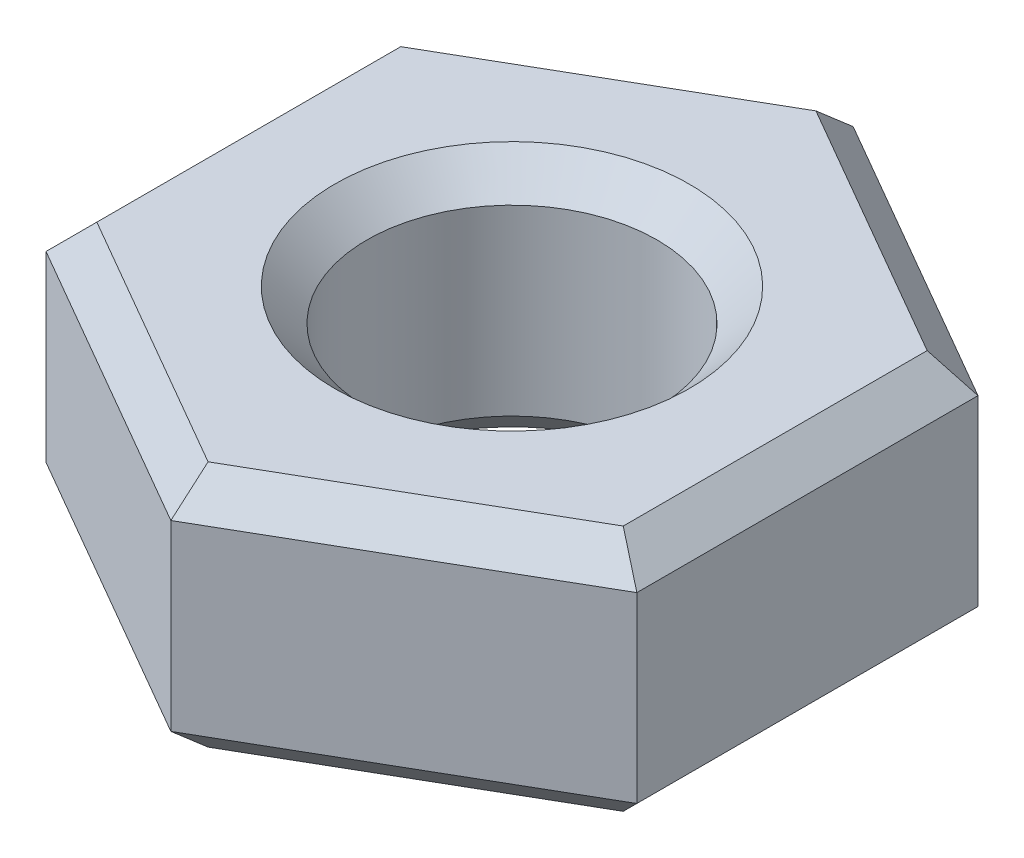
ISO-10303-21;
HEADER;
FILE_DESCRIPTION(('STEP AP214'),'2;1');
FILE_NAME('part.step','',(''),(''),'','','');
FILE_SCHEMA(('AUTOMOTIVE_DESIGN { 1 0 10303 214 1 1 1 1 }'));
ENDSEC;
DATA;
#1=APPLICATION_CONTEXT('core data for automotive mechanical design processes');
#2=APPLICATION_PROTOCOL_DEFINITION('international standard','automotive_design',2000,#1);
#3=PRODUCT_CONTEXT('',#1,'mechanical');
#4=PRODUCT('Part','Part','',(#3));
#5=PRODUCT_RELATED_PRODUCT_CATEGORY('part','',(#4));
#6=PRODUCT_DEFINITION_FORMATION('','',#4);
#7=PRODUCT_DEFINITION_CONTEXT('part definition',#1,'design');
#8=PRODUCT_DEFINITION('design','',#6,#7);
#9=PRODUCT_DEFINITION_SHAPE('','',#8);
#10=(LENGTH_UNIT() NAMED_UNIT(*) SI_UNIT(.MILLI.,.METRE.));
#11=(NAMED_UNIT(*) PLANE_ANGLE_UNIT() SI_UNIT($,.RADIAN.));
#12=(NAMED_UNIT(*) SI_UNIT($,.STERADIAN.) SOLID_ANGLE_UNIT());
#13=UNCERTAINTY_MEASURE_WITH_UNIT(LENGTH_MEASURE(1.E-05),#10,'distance_accuracy_value','');
#14=(GEOMETRIC_REPRESENTATION_CONTEXT(3) GLOBAL_UNCERTAINTY_ASSIGNED_CONTEXT((#13)) GLOBAL_UNIT_ASSIGNED_CONTEXT((#10,
#11,#12)) REPRESENTATION_CONTEXT('',''));
#15=CARTESIAN_POINT('',(0.,0.,0.));
#16=DIRECTION('',(0.,0.,1.));
#17=DIRECTION('',(1.,0.,0.));
#18=AXIS2_PLACEMENT_3D('',#15,#16,#17);
#19=CARTESIAN_POINT('',(0.,2.3,0.));
#20=DIRECTION('',(0.,1.,0.));
#21=DIRECTION('',(0.,0.,1.));
#22=AXIS2_PLACEMENT_3D('',#19,#20,#21);
#23=PLANE('',#22);
#24=CARTESIAN_POINT('',(0.,2.3,0.));
#25=DIRECTION('',(0.,1.,0.));
#26=DIRECTION('',(0.,0.,1.));
#27=AXIS2_PLACEMENT_3D('',#24,#25,#26);
#28=CIRCLE('',#27,1.65);
#29=CARTESIAN_POINT('',(0.,2.3,1.65));
#30=VERTEX_POINT('',#29);
#31=EDGE_CURVE('E11',#30,#30,#28,.F.);
#32=ORIENTED_EDGE('',*,*,#31,.T.);
#33=EDGE_LOOP('',(#32));
#34=FACE_BOUND('',#33,.T.);
#35=DIRECTION('',(0.,0.,1.));
#36=VECTOR('',#35,1.);
#37=CARTESIAN_POINT('',(-2.45000000000001,2.3,1.58771324027146));
#38=LINE('',#37,#36);
#39=CARTESIAN_POINT('',(-2.45,2.3,-1.41450815951459));
#40=VERTEX_POINT('',#39);
#41=CARTESIAN_POINT('',(-2.45000000000001,2.3,1.41450815951458));
#42=VERTEX_POINT('',#41);
#43=EDGE_CURVE('E50',#40,#42,#38,.T.);
#44=ORIENTED_EDGE('',*,*,#43,.T.);
#45=DIRECTION('',(0.866025403784437,0.,0.500000000000003));
#46=VECTOR('',#45,1.);
#47=CARTESIAN_POINT('',(0.14999999999999,2.3,2.91561885940761));
#48=LINE('',#47,#46);
#49=CARTESIAN_POINT('',(0.,2.3,2.82901631902917));
#50=VERTEX_POINT('',#49);
#51=EDGE_CURVE('E42',#42,#50,#48,.T.);
#52=ORIENTED_EDGE('',*,*,#51,.T.);
#53=DIRECTION('',(0.86602540378444,0.,-0.499999999999997));
#54=VECTOR('',#53,1.);
#55=CARTESIAN_POINT('',(2.6,2.3,1.32790561913615));
#56=LINE('',#55,#54);
#57=CARTESIAN_POINT('',(2.45,2.3,1.41450815951459));
#58=VERTEX_POINT('',#57);
#59=EDGE_CURVE('E189',#50,#58,#56,.T.);
#60=ORIENTED_EDGE('',*,*,#59,.T.);
#61=DIRECTION('',(0.,0.,-1.));
#62=VECTOR('',#61,1.);
#63=CARTESIAN_POINT('',(2.45000000000001,2.3,-1.58771324027146));
#64=LINE('',#63,#62);
#65=CARTESIAN_POINT('',(2.45000000000001,2.3,-1.41450815951458));
#66=VERTEX_POINT('',#65);
#67=EDGE_CURVE('E191',#58,#66,#64,.T.);
#68=ORIENTED_EDGE('',*,*,#67,.T.);
#69=DIRECTION('',(-0.866025403784437,0.,-0.500000000000003));
#70=VECTOR('',#69,1.);
#71=CARTESIAN_POINT('',(-0.149999999999986,2.3,-2.91561885940761));
#72=LINE('',#71,#70);
#73=CARTESIAN_POINT('',(0.,2.3,-2.82901631902917));
#74=VERTEX_POINT('',#73);
#75=EDGE_CURVE('E193',#66,#74,#72,.T.);
#76=ORIENTED_EDGE('',*,*,#75,.T.);
#77=DIRECTION('',(-0.86602540378444,0.,0.499999999999997));
#78=VECTOR('',#77,1.);
#79=CARTESIAN_POINT('',(-2.6,2.3,-1.32790561913615));
#80=LINE('',#79,#78);
#81=EDGE_CURVE('E55',#74,#40,#80,.T.);
#82=ORIENTED_EDGE('',*,*,#81,.T.);
#83=EDGE_LOOP('',(#44,#52,#60,#68,#76,#82));
#84=FACE_BOUND('',#83,.T.);
#85=ADVANCED_FACE('F33',(#34,#84),#23,.T.);
#86=CARTESIAN_POINT('',(0.,0.,0.));
#87=DIRECTION('',(0.,1.,0.));
#88=DIRECTION('',(0.,0.,1.));
#89=AXIS2_PLACEMENT_3D('',#86,#87,#88);
#90=PLANE('',#89);
#91=CARTESIAN_POINT('',(0.,0.,0.));
#92=DIRECTION('',(0.,1.,0.));
#93=DIRECTION('',(0.,0.,1.));
#94=AXIS2_PLACEMENT_3D('',#91,#92,#93);
#95=CIRCLE('',#94,1.65);
#96=CARTESIAN_POINT('',(0.,0.,-1.65));
#97=VERTEX_POINT('',#96);
#98=EDGE_CURVE('E151',#97,#97,#95,.T.);
#99=ORIENTED_EDGE('',*,*,#98,.T.);
#100=EDGE_LOOP('',(#99));
#101=FACE_BOUND('',#100,.T.);
#102=DIRECTION('',(0.866025403784437,0.,0.500000000000003));
#103=VECTOR('',#102,1.);
#104=CARTESIAN_POINT('',(1.22500000000001,0.,-2.12176223927187));
#105=LINE('',#104,#103);
#106=CARTESIAN_POINT('',(0.,0.,-2.82901631902916));
#107=VERTEX_POINT('',#106);
#108=CARTESIAN_POINT('',(2.45,0.,-1.41450815951457));
#109=VERTEX_POINT('',#108);
#110=EDGE_CURVE('E150',#107,#109,#105,.T.);
#111=ORIENTED_EDGE('',*,*,#110,.T.);
#112=DIRECTION('',(0.,0.,1.));
#113=VECTOR('',#112,1.);
#114=CARTESIAN_POINT('',(2.45,0.,0.));
#115=LINE('',#114,#113);
#116=CARTESIAN_POINT('',(2.44999999999999,0.,1.41450815951459));
#117=VERTEX_POINT('',#116);
#118=EDGE_CURVE('E129',#109,#117,#115,.T.);
#119=ORIENTED_EDGE('',*,*,#118,.T.);
#120=DIRECTION('',(-0.86602540378444,0.,0.499999999999997));
#121=VECTOR('',#120,1.);
#122=CARTESIAN_POINT('',(1.22499999999999,0.,2.12176223927188));
#123=LINE('',#122,#121);
#124=CARTESIAN_POINT('',(0.,0.,2.82901631902916));
#125=VERTEX_POINT('',#124);
#126=EDGE_CURVE('E139',#117,#125,#123,.T.);
#127=ORIENTED_EDGE('',*,*,#126,.T.);
#128=DIRECTION('',(-0.866025403784437,0.,-0.500000000000003));
#129=VECTOR('',#128,1.);
#130=CARTESIAN_POINT('',(-1.22500000000001,0.,2.12176223927187));
#131=LINE('',#130,#129);
#132=CARTESIAN_POINT('',(-2.45,0.,1.41450815951457));
#133=VERTEX_POINT('',#132);
#134=EDGE_CURVE('E145',#125,#133,#131,.T.);
#135=ORIENTED_EDGE('',*,*,#134,.T.);
#136=DIRECTION('',(0.,0.,-1.));
#137=VECTOR('',#136,1.);
#138=CARTESIAN_POINT('',(-2.45,0.,0.));
#139=LINE('',#138,#137);
#140=CARTESIAN_POINT('',(-2.44999999999999,0.,-1.41450815951459));
#141=VERTEX_POINT('',#140);
#142=EDGE_CURVE('E251',#133,#141,#139,.T.);
#143=ORIENTED_EDGE('',*,*,#142,.T.);
#144=DIRECTION('',(0.86602540378444,0.,-0.499999999999997));
#145=VECTOR('',#144,1.);
#146=CARTESIAN_POINT('',(-1.22499999999999,0.,-2.12176223927188));
#147=LINE('',#146,#145);
#148=EDGE_CURVE('E156',#141,#107,#147,.T.);
#149=ORIENTED_EDGE('',*,*,#148,.T.);
#150=EDGE_LOOP('',(#111,#119,#127,#135,#143,#149));
#151=FACE_BOUND('',#150,.T.);
#152=ADVANCED_FACE('F148',(#101,#151),#90,.F.);
#153=CARTESIAN_POINT('',(0.,2.3,3.17542648054294));
#154=DIRECTION('',(-0.499999999999997,0.,-0.86602540378444));
#155=DIRECTION('',(-0.86602540378444,0.,0.499999999999997));
#156=AXIS2_PLACEMENT_3D('',#153,#154,#155);
#157=PLANE('',#156);
#158=DIRECTION('',(0.,-1.,0.));
#159=VECTOR('',#158,1.);
#160=CARTESIAN_POINT('',(0.,2.3,3.17542648054294));
#161=LINE('',#160,#159);
#162=CARTESIAN_POINT('',(0.,2.,3.17542648054294));
#163=VERTEX_POINT('',#162);
#164=CARTESIAN_POINT('',(0.,0.3,3.17542648054294));
#165=VERTEX_POINT('',#164);
#166=EDGE_CURVE('E208',#163,#165,#161,.T.);
#167=ORIENTED_EDGE('',*,*,#166,.T.);
#168=DIRECTION('',(0.86602540378444,0.,-0.499999999999997));
#169=VECTOR('',#168,1.);
#170=CARTESIAN_POINT('',(0.,0.3,3.17542648054294));
#171=LINE('',#170,#169);
#172=CARTESIAN_POINT('',(2.75,0.3,1.58771324027148));
#173=VERTEX_POINT('',#172);
#174=EDGE_CURVE('E187',#165,#173,#171,.T.);
#175=ORIENTED_EDGE('',*,*,#174,.T.);
#176=DIRECTION('',(0.,-1.,0.));
#177=VECTOR('',#176,1.);
#178=CARTESIAN_POINT('',(2.75,2.3,1.58771324027148));
#179=LINE('',#178,#177);
#180=CARTESIAN_POINT('',(2.75,2.,1.58771324027148));
#181=VERTEX_POINT('',#180);
#182=EDGE_CURVE('E146',#181,#173,#179,.T.);
#183=ORIENTED_EDGE('',*,*,#182,.F.);
#184=DIRECTION('',(-0.86602540378444,0.,0.499999999999997));
#185=VECTOR('',#184,1.);
#186=CARTESIAN_POINT('',(0.,2.,3.17542648054294));
#187=LINE('',#186,#185);
#188=EDGE_CURVE('E185',#181,#163,#187,.T.);
#189=ORIENTED_EDGE('',*,*,#188,.T.);
#190=EDGE_LOOP('',(#167,#175,#183,#189));
#191=FACE_BOUND('',#190,.T.);
#192=ADVANCED_FACE('F275',(#191),#157,.F.);
#193=CARTESIAN_POINT('',(2.75,2.3,1.58771324027148));
#194=DIRECTION('',(-1.,0.,0.));
#195=DIRECTION('',(0.,0.,1.));
#196=AXIS2_PLACEMENT_3D('',#193,#194,#195);
#197=PLANE('',#196);
#198=ORIENTED_EDGE('',*,*,#182,.T.);
#199=DIRECTION('',(0.,0.,-1.));
#200=VECTOR('',#199,1.);
#201=CARTESIAN_POINT('',(2.75,0.300000000000001,1.58771324027148));
#202=LINE('',#201,#200);
#203=CARTESIAN_POINT('',(2.75,0.300000000000001,-1.58771324027146));
#204=VERTEX_POINT('',#203);
#205=EDGE_CURVE('E132',#173,#204,#202,.T.);
#206=ORIENTED_EDGE('',*,*,#205,.T.);
#207=DIRECTION('',(0.,-1.,0.));
#208=VECTOR('',#207,1.);
#209=CARTESIAN_POINT('',(2.75,2.3,-1.58771324027146));
#210=LINE('',#209,#208);
#211=CARTESIAN_POINT('',(2.75,2.,-1.58771324027146));
#212=VERTEX_POINT('',#211);
#213=EDGE_CURVE('E237',#212,#204,#210,.T.);
#214=ORIENTED_EDGE('',*,*,#213,.F.);
#215=DIRECTION('',(0.,0.,1.));
#216=VECTOR('',#215,1.);
#217=CARTESIAN_POINT('',(2.75,2.,1.58771324027148));
#218=LINE('',#217,#216);
#219=EDGE_CURVE('E165',#212,#181,#218,.T.);
#220=ORIENTED_EDGE('',*,*,#219,.T.);
#221=EDGE_LOOP('',(#198,#206,#214,#220));
#222=FACE_BOUND('',#221,.T.);
#223=ADVANCED_FACE('F242',(#222),#197,.F.);
#224=CARTESIAN_POINT('',(2.75,2.3,-1.58771324027146));
#225=DIRECTION('',(-0.500000000000003,0.,0.866025403784437));
#226=DIRECTION('',(0.866025403784437,0.,0.500000000000003));
#227=AXIS2_PLACEMENT_3D('',#224,#225,#226);
#228=PLANE('',#227);
#229=ORIENTED_EDGE('',*,*,#213,.T.);
#230=DIRECTION('',(-0.866025403784437,0.,-0.500000000000003));
#231=VECTOR('',#230,1.);
#232=CARTESIAN_POINT('',(2.75,0.300000000000001,-1.58771324027146));
#233=LINE('',#232,#231);
#234=CARTESIAN_POINT('',(0.,0.300000000000001,-3.17542648054294));
#235=VERTEX_POINT('',#234);
#236=EDGE_CURVE('E170',#204,#235,#233,.T.);
#237=ORIENTED_EDGE('',*,*,#236,.T.);
#238=DIRECTION('',(0.,-1.,0.));
#239=VECTOR('',#238,1.);
#240=CARTESIAN_POINT('',(0.,2.3,-3.17542648054294));
#241=LINE('',#240,#239);
#242=CARTESIAN_POINT('',(0.,2.,-3.17542648054294));
#243=VERTEX_POINT('',#242);
#244=EDGE_CURVE('E239',#243,#235,#241,.T.);
#245=ORIENTED_EDGE('',*,*,#244,.F.);
#246=DIRECTION('',(0.866025403784437,0.,0.500000000000003));
#247=VECTOR('',#246,1.);
#248=CARTESIAN_POINT('',(2.75,2.,-1.58771324027146));
#249=LINE('',#248,#247);
#250=EDGE_CURVE('E168',#243,#212,#249,.T.);
#251=ORIENTED_EDGE('',*,*,#250,.T.);
#252=EDGE_LOOP('',(#229,#237,#245,#251));
#253=FACE_BOUND('',#252,.T.);
#254=ADVANCED_FACE('F236',(#253),#228,.F.);
#255=CARTESIAN_POINT('',(0.,2.3,-3.17542648054294));
#256=DIRECTION('',(0.499999999999997,0.,0.86602540378444));
#257=DIRECTION('',(0.86602540378444,0.,-0.499999999999997));
#258=AXIS2_PLACEMENT_3D('',#255,#256,#257);
#259=PLANE('',#258);
#260=ORIENTED_EDGE('',*,*,#244,.T.);
#261=DIRECTION('',(-0.86602540378444,0.,0.499999999999997));
#262=VECTOR('',#261,1.);
#263=CARTESIAN_POINT('',(0.,0.300000000000001,-3.17542648054294));
#264=LINE('',#263,#262);
#265=CARTESIAN_POINT('',(-2.74999999999999,0.300000000000001,-1.58771324027148));
#266=VERTEX_POINT('',#265);
#267=EDGE_CURVE('E174',#235,#266,#264,.T.);
#268=ORIENTED_EDGE('',*,*,#267,.T.);
#269=DIRECTION('',(0.,-1.,0.));
#270=VECTOR('',#269,1.);
#271=CARTESIAN_POINT('',(-2.74999999999999,2.3,-1.58771324027148));
#272=LINE('',#271,#270);
#273=CARTESIAN_POINT('',(-2.74999999999999,2.,-1.58771324027148));
#274=VERTEX_POINT('',#273);
#275=EDGE_CURVE('E246',#274,#266,#272,.T.);
#276=ORIENTED_EDGE('',*,*,#275,.F.);
#277=DIRECTION('',(0.86602540378444,0.,-0.499999999999997));
#278=VECTOR('',#277,1.);
#279=CARTESIAN_POINT('',(0.,2.,-3.17542648054294));
#280=LINE('',#279,#278);
#281=EDGE_CURVE('E172',#274,#243,#280,.T.);
#282=ORIENTED_EDGE('',*,*,#281,.T.);
#283=EDGE_LOOP('',(#260,#268,#276,#282));
#284=FACE_BOUND('',#283,.T.);
#285=ADVANCED_FACE('F263',(#284),#259,.F.);
#286=CARTESIAN_POINT('',(-2.74999999999999,2.3,-1.58771324027148));
#287=DIRECTION('',(1.,0.,0.));
#288=DIRECTION('',(0.,0.,-1.));
#289=AXIS2_PLACEMENT_3D('',#286,#287,#288);
#290=PLANE('',#289);
#291=ORIENTED_EDGE('',*,*,#275,.T.);
#292=DIRECTION('',(0.,0.,1.));
#293=VECTOR('',#292,1.);
#294=CARTESIAN_POINT('',(-2.74999999999999,0.300000000000001,-1.58771324027148));
#295=LINE('',#294,#293);
#296=CARTESIAN_POINT('',(-2.75,0.300000000000001,1.58771324027146));
#297=VERTEX_POINT('',#296);
#298=EDGE_CURVE('E178',#266,#297,#295,.T.);
#299=ORIENTED_EDGE('',*,*,#298,.T.);
#300=DIRECTION('',(0.,-1.,0.));
#301=VECTOR('',#300,1.);
#302=CARTESIAN_POINT('',(-2.75,2.3,1.58771324027146));
#303=LINE('',#302,#301);
#304=CARTESIAN_POINT('',(-2.75,2.,1.58771324027146));
#305=VERTEX_POINT('',#304);
#306=EDGE_CURVE('E268',#305,#297,#303,.T.);
#307=ORIENTED_EDGE('',*,*,#306,.F.);
#308=DIRECTION('',(0.,0.,-1.));
#309=VECTOR('',#308,1.);
#310=CARTESIAN_POINT('',(-2.74999999999999,2.,-1.58771324027148));
#311=LINE('',#310,#309);
#312=EDGE_CURVE('E176',#305,#274,#311,.T.);
#313=ORIENTED_EDGE('',*,*,#312,.T.);
#314=EDGE_LOOP('',(#291,#299,#307,#313));
#315=FACE_BOUND('',#314,.T.);
#316=ADVANCED_FACE('F286',(#315),#290,.F.);
#317=CARTESIAN_POINT('',(-2.75,2.3,1.58771324027146));
#318=DIRECTION('',(0.500000000000003,0.,-0.866025403784437));
#319=DIRECTION('',(-0.866025403784437,0.,-0.500000000000003));
#320=AXIS2_PLACEMENT_3D('',#317,#318,#319);
#321=PLANE('',#320);
#322=ORIENTED_EDGE('',*,*,#306,.T.);
#323=DIRECTION('',(0.866025403784437,0.,0.500000000000003));
#324=VECTOR('',#323,1.);
#325=CARTESIAN_POINT('',(-2.75,0.300000000000001,1.58771324027146));
#326=LINE('',#325,#324);
#327=EDGE_CURVE('E183',#297,#165,#326,.T.);
#328=ORIENTED_EDGE('',*,*,#327,.T.);
#329=ORIENTED_EDGE('',*,*,#166,.F.);
#330=DIRECTION('',(-0.866025403784437,0.,-0.500000000000003));
#331=VECTOR('',#330,1.);
#332=CARTESIAN_POINT('',(-2.75,2.,1.58771324027146));
#333=LINE('',#332,#331);
#334=EDGE_CURVE('E180',#163,#305,#333,.T.);
#335=ORIENTED_EDGE('',*,*,#334,.T.);
#336=EDGE_LOOP('',(#322,#328,#329,#335));
#337=FACE_BOUND('',#336,.T.);
#338=ADVANCED_FACE('F287',(#337),#321,.F.);
#339=CARTESIAN_POINT('',(0.,2.3,0.));
#340=DIRECTION('',(0.,-1.,0.));
#341=DIRECTION('',(0.,0.,-1.));
#342=AXIS2_PLACEMENT_3D('',#339,#340,#341);
#343=CYLINDRICAL_SURFACE('',#342,1.35);
#344=CARTESIAN_POINT('',(0.,0.300000000000001,0.));
#345=DIRECTION('',(0.,1.,0.));
#346=DIRECTION('',(0.,0.,1.));
#347=AXIS2_PLACEMENT_3D('',#344,#345,#346);
#348=CIRCLE('',#347,1.35);
#349=CARTESIAN_POINT('',(0.,0.300000000000001,-1.35));
#350=VERTEX_POINT('',#349);
#351=EDGE_CURVE('E162',#350,#350,#348,.F.);
#352=ORIENTED_EDGE('',*,*,#351,.T.);
#353=EDGE_LOOP('',(#352));
#354=FACE_BOUND('',#353,.T.);
#355=CARTESIAN_POINT('',(0.,2.,0.));
#356=DIRECTION('',(0.,1.,0.));
#357=DIRECTION('',(0.,0.,1.));
#358=AXIS2_PLACEMENT_3D('',#355,#356,#357);
#359=CIRCLE('',#358,1.35);
#360=CARTESIAN_POINT('',(0.,2.,1.35));
#361=VERTEX_POINT('',#360);
#362=EDGE_CURVE('E154',#361,#361,#359,.T.);
#363=ORIENTED_EDGE('',*,*,#362,.T.);
#364=EDGE_LOOP('',(#363));
#365=FACE_BOUND('',#364,.T.);
#366=ADVANCED_FACE('F306',(#354,#365),#343,.F.);
#367=CARTESIAN_POINT('',(0.,0.,0.));
#368=DIRECTION('',(0.,-1.,0.));
#369=DIRECTION('',(0.,0.,-1.));
#370=AXIS2_PLACEMENT_3D('',#367,#368,#369);
#371=CONICAL_SURFACE('',#370,1.65,0.785398163397446);
#372=CARTESIAN_POINT('',(0.,0.300000000000001,-1.35));
#373=CARTESIAN_POINT('',(0.,0.296875000000001,-1.353125));
#374=CARTESIAN_POINT('',(0.,0.293750000000001,-1.35625));
#375=CARTESIAN_POINT('',(0.,0.287500000000001,-1.3625));
#376=CARTESIAN_POINT('',(0.,0.284375000000001,-1.365625));
#377=CARTESIAN_POINT('',(0.,0.278125000000001,-1.371875));
#378=CARTESIAN_POINT('',(0.,0.275000000000001,-1.375));
#379=CARTESIAN_POINT('',(0.,0.268750000000001,-1.38125));
#380=CARTESIAN_POINT('',(0.,0.265625000000001,-1.384375));
#381=CARTESIAN_POINT('',(0.,0.259375000000001,-1.390625));
#382=CARTESIAN_POINT('',(0.,0.256250000000001,-1.39375));
#383=CARTESIAN_POINT('',(0.,0.250000000000001,-1.4));
#384=CARTESIAN_POINT('',(0.,0.246875000000001,-1.403125));
#385=CARTESIAN_POINT('',(0.,0.240625000000001,-1.409375));
#386=CARTESIAN_POINT('',(0.,0.237500000000001,-1.4125));
#387=CARTESIAN_POINT('',(0.,0.231250000000001,-1.41875));
#388=CARTESIAN_POINT('',(0.,0.228125000000001,-1.421875));
#389=CARTESIAN_POINT('',(0.,0.221875000000001,-1.428125));
#390=CARTESIAN_POINT('',(0.,0.218750000000001,-1.43125));
#391=CARTESIAN_POINT('',(0.,0.212500000000001,-1.4375));
#392=CARTESIAN_POINT('',(0.,0.209375000000001,-1.440625));
#393=CARTESIAN_POINT('',(0.,0.203125,-1.446875));
#394=CARTESIAN_POINT('',(0.,0.200000000000001,-1.45));
#395=CARTESIAN_POINT('',(0.,0.193750000000001,-1.45625));
#396=CARTESIAN_POINT('',(0.,0.190625,-1.459375));
#397=CARTESIAN_POINT('',(0.,0.184375,-1.465625));
#398=CARTESIAN_POINT('',(0.,0.18125,-1.46875));
#399=CARTESIAN_POINT('',(0.,0.175,-1.475));
#400=CARTESIAN_POINT('',(0.,0.171875,-1.478125));
#401=CARTESIAN_POINT('',(0.,0.165625,-1.484375));
#402=CARTESIAN_POINT('',(0.,0.1625,-1.4875));
#403=CARTESIAN_POINT('',(0.,0.15625,-1.49375));
#404=CARTESIAN_POINT('',(0.,0.153125,-1.496875));
#405=CARTESIAN_POINT('',(0.,0.146875,-1.503125));
#406=CARTESIAN_POINT('',(0.,0.14375,-1.50625));
#407=CARTESIAN_POINT('',(0.,0.1375,-1.5125));
#408=CARTESIAN_POINT('',(0.,0.134375,-1.515625));
#409=CARTESIAN_POINT('',(0.,0.128125,-1.521875));
#410=CARTESIAN_POINT('',(0.,0.125,-1.525));
#411=CARTESIAN_POINT('',(0.,0.11875,-1.53125));
#412=CARTESIAN_POINT('',(0.,0.115625,-1.534375));
#413=CARTESIAN_POINT('',(0.,0.109375,-1.540625));
#414=CARTESIAN_POINT('',(0.,0.10625,-1.54375));
#415=CARTESIAN_POINT('',(0.,0.1,-1.55));
#416=CARTESIAN_POINT('',(0.,0.0968750000000002,-1.553125));
#417=CARTESIAN_POINT('',(0.,0.0906250000000002,-1.559375));
#418=CARTESIAN_POINT('',(0.,0.0875000000000002,-1.5625));
#419=CARTESIAN_POINT('',(0.,0.0812500000000002,-1.56875));
#420=CARTESIAN_POINT('',(0.,0.0781250000000002,-1.571875));
#421=CARTESIAN_POINT('',(0.,0.0718750000000001,-1.578125));
#422=CARTESIAN_POINT('',(0.,0.0687500000000002,-1.58125));
#423=CARTESIAN_POINT('',(0.,0.0625000000000002,-1.5875));
#424=CARTESIAN_POINT('',(0.,0.0593750000000002,-1.590625));
#425=CARTESIAN_POINT('',(0.,0.0531250000000002,-1.596875));
#426=CARTESIAN_POINT('',(0.,0.0500000000000001,-1.6));
#427=CARTESIAN_POINT('',(0.,0.0437500000000001,-1.60625));
#428=CARTESIAN_POINT('',(0.,0.0406250000000001,-1.609375));
#429=CARTESIAN_POINT('',(0.,0.0343750000000001,-1.615625));
#430=CARTESIAN_POINT('',(0.,0.03125,-1.61875));
#431=CARTESIAN_POINT('',(0.,0.025,-1.625));
#432=CARTESIAN_POINT('',(0.,0.0218750000000001,-1.628125));
#433=CARTESIAN_POINT('',(0.,0.0156250000000001,-1.634375));
#434=CARTESIAN_POINT('',(0.,0.0125000000000001,-1.6375));
#435=CARTESIAN_POINT('',(0.,0.00625,-1.64375));
#436=CARTESIAN_POINT('',(0.,0.00312499999999997,-1.646875));
#437=CARTESIAN_POINT('',(0.,0.,-1.65));
#438=B_SPLINE_CURVE_WITH_KNOTS('',3,(#372,#373,#374,#375,#376,#377,#378,#379,#380,#381,#382,
#383,#384,#385,#386,#387,#388,#389,#390,#391,#392,#393,#394,#395,#396,#397,#398,#399,#400,#401,
#402,#403,#404,#405,#406,#407,#408,#409,#410,#411,#412,#413,#414,#415,#416,#417,#418,#419,#420,
#421,#422,#423,#424,#425,#426,#427,#428,#429,#430,#431,#432,#433,#434,#435,#436,#437),
.UNSPECIFIED.,.F.,.F.,(4,2,2,2,2,2,2,2,2,2,2,2,2,2,2,2,2,2,2,2,2,2,2,2,2,2,2,2,2,2,2,2,4),(0.,
0.0132582521472478,0.0265165042944955,0.0397747564417433,0.053033008588991,0.066291260736239,
0.0795495128834866,0.0928077650307344,0.106066017177982,0.11932426932523,0.132582521472478,
0.145840773619726,0.159099025766973,0.172357277914221,0.185615530061469,0.198873782208717,
0.212132034355964,0.225390286503212,0.23864853865046,0.251906790797708,0.265165042944955,
0.278423295092203,0.291681547239451,0.304939799386699,0.318198051533946,0.331456303681194,
0.344714555828442,0.35797280797569,0.371231060122938,0.384489312270186,0.397747564417433,
0.411005816564681,0.424264068711929),.UNSPECIFIED.);
#439=EDGE_CURVE('BSEAM320',#350,#97,#438,.T.);
#440=ORIENTED_EDGE('',*,*,#351,.F.);
#441=ORIENTED_EDGE('',*,*,#98,.F.);
#442=ORIENTED_EDGE('',*,*,#439,.T.);
#443=ORIENTED_EDGE('',*,*,#439,.F.);
#444=EDGE_LOOP('',(#440,#442,#441,#443));
#445=FACE_BOUND('',#444,.T.);
#446=ADVANCED_FACE('F320',(#445),#371,.F.);
#447=CARTESIAN_POINT('',(-2.74999999999999,0.300000000000001,-1.58771324027148));
#448=DIRECTION('',(0.707106781186546,0.707106781186549,0.));
#449=DIRECTION('',(0.,0.,1.));
#450=AXIS2_PLACEMENT_3D('',#447,#448,#449);
#451=PLANE('',#450);
#452=DIRECTION('',(0.654653670707977,-0.654653670707976,0.37796447300923));
#453=VECTOR('',#452,1.);
#454=CARTESIAN_POINT('',(-2.74999999999999,0.300000000000001,-1.58771324027148));
#455=LINE('',#454,#453);
#456=EDGE_CURVE('E202',#141,#266,#455,.F.);
#457=ORIENTED_EDGE('',*,*,#456,.F.);
#458=ORIENTED_EDGE('',*,*,#142,.F.);
#459=DIRECTION('',(0.65465367070798,-0.654653670707975,-0.377964473009226));
#460=VECTOR('',#459,1.);
#461=CARTESIAN_POINT('',(-2.75,0.300000000000001,1.58771324027146));
#462=LINE('',#461,#460);
#463=EDGE_CURVE('E205',#297,#133,#462,.T.);
#464=ORIENTED_EDGE('',*,*,#463,.F.);
#465=ORIENTED_EDGE('',*,*,#298,.F.);
#466=EDGE_LOOP('',(#457,#458,#464,#465));
#467=FACE_BOUND('',#466,.T.);
#468=ADVANCED_FACE('F284',(#467),#451,.F.);
#469=CARTESIAN_POINT('',(-2.75,0.300000000000001,1.58771324027146));
#470=DIRECTION('',(0.353553390593275,0.707106781186549,-0.612372435695792));
#471=DIRECTION('',(0.866025403784437,0.,0.500000000000003));
#472=AXIS2_PLACEMENT_3D('',#469,#470,#471);
#473=PLANE('',#472);
#474=ORIENTED_EDGE('',*,*,#463,.T.);
#475=ORIENTED_EDGE('',*,*,#134,.F.);
#476=DIRECTION('',(0.,-0.654653670707975,-0.755928946018456));
#477=VECTOR('',#476,1.);
#478=CARTESIAN_POINT('',(0.,0.300000000000001,3.17542648054294));
#479=LINE('',#478,#477);
#480=EDGE_CURVE('E142',#165,#125,#479,.T.);
#481=ORIENTED_EDGE('',*,*,#480,.F.);
#482=ORIENTED_EDGE('',*,*,#327,.F.);
#483=EDGE_LOOP('',(#474,#475,#481,#482));
#484=FACE_BOUND('',#483,.T.);
#485=ADVANCED_FACE('F281',(#484),#473,.F.);
#486=CARTESIAN_POINT('',(0.,0.300000000000001,-3.17542648054294));
#487=DIRECTION('',(0.353553390593271,0.707106781186549,0.612372435695795));
#488=DIRECTION('',(-0.86602540378444,0.,0.499999999999997));
#489=AXIS2_PLACEMENT_3D('',#486,#487,#488);
#490=PLANE('',#489);
#491=ORIENTED_EDGE('',*,*,#456,.T.);
#492=ORIENTED_EDGE('',*,*,#267,.F.);
#493=DIRECTION('',(0.,-0.654653670707976,0.755928946018456));
#494=VECTOR('',#493,1.);
#495=CARTESIAN_POINT('',(0.,0.300000000000001,-3.17542648054294));
#496=LINE('',#495,#494);
#497=EDGE_CURVE('E135',#107,#235,#496,.F.);
#498=ORIENTED_EDGE('',*,*,#497,.F.);
#499=ORIENTED_EDGE('',*,*,#148,.F.);
#500=EDGE_LOOP('',(#491,#492,#498,#499));
#501=FACE_BOUND('',#500,.T.);
#502=ADVANCED_FACE('F258',(#501),#490,.F.);
#503=CARTESIAN_POINT('',(0.,0.300000000000001,3.17542648054294));
#504=DIRECTION('',(-0.353553390593271,0.707106781186549,-0.612372435695794));
#505=DIRECTION('',(0.86602540378444,0.,-0.499999999999997));
#506=AXIS2_PLACEMENT_3D('',#503,#504,#505);
#507=PLANE('',#506);
#508=ORIENTED_EDGE('',*,*,#480,.T.);
#509=ORIENTED_EDGE('',*,*,#126,.F.);
#510=DIRECTION('',(0.654653670707977,0.654653670707975,0.377964473009231));
#511=VECTOR('',#510,1.);
#512=CARTESIAN_POINT('',(1.96428571428571,-0.485714285714284,1.1340808859082));
#513=LINE('',#512,#511);
#514=EDGE_CURVE('E125',#173,#117,#513,.F.);
#515=ORIENTED_EDGE('',*,*,#514,.F.);
#516=ORIENTED_EDGE('',*,*,#174,.F.);
#517=EDGE_LOOP('',(#508,#509,#515,#516));
#518=FACE_BOUND('',#517,.T.);
#519=ADVANCED_FACE('F140',(#518),#507,.F.);
#520=CARTESIAN_POINT('',(2.75,0.300000000000001,-1.58771324027146));
#521=DIRECTION('',(-0.353553390593275,0.707106781186549,0.612372435695792));
#522=DIRECTION('',(-0.866025403784437,0.,-0.500000000000003));
#523=AXIS2_PLACEMENT_3D('',#520,#521,#522);
#524=PLANE('',#523);
#525=ORIENTED_EDGE('',*,*,#497,.T.);
#526=ORIENTED_EDGE('',*,*,#236,.F.);
#527=DIRECTION('',(-0.65465367070798,-0.654653670707976,0.377964473009226));
#528=VECTOR('',#527,1.);
#529=CARTESIAN_POINT('',(2.75,0.300000000000001,-1.58771324027146));
#530=LINE('',#529,#528);
#531=EDGE_CURVE('E136',#109,#204,#530,.F.);
#532=ORIENTED_EDGE('',*,*,#531,.F.);
#533=ORIENTED_EDGE('',*,*,#110,.F.);
#534=EDGE_LOOP('',(#525,#526,#532,#533));
#535=FACE_BOUND('',#534,.T.);
#536=ADVANCED_FACE('F261',(#535),#524,.F.);
#537=CARTESIAN_POINT('',(2.75,0.300000000000001,1.58771324027148));
#538=DIRECTION('',(-0.707106781186546,0.707106781186549,0.));
#539=DIRECTION('',(0.,0.,-1.));
#540=AXIS2_PLACEMENT_3D('',#537,#538,#539);
#541=PLANE('',#540);
#542=ORIENTED_EDGE('',*,*,#514,.T.);
#543=ORIENTED_EDGE('',*,*,#118,.F.);
#544=ORIENTED_EDGE('',*,*,#531,.T.);
#545=ORIENTED_EDGE('',*,*,#205,.F.);
#546=EDGE_LOOP('',(#542,#543,#544,#545));
#547=FACE_BOUND('',#546,.T.);
#548=ADVANCED_FACE('F127',(#547),#541,.F.);
#549=CARTESIAN_POINT('',(0.,2.,0.));
#550=DIRECTION('',(0.,1.,0.));
#551=DIRECTION('',(0.,0.,1.));
#552=AXIS2_PLACEMENT_3D('',#549,#550,#551);
#553=CONICAL_SURFACE('',#552,1.35,0.78539816339745);
#554=ORIENTED_EDGE('',*,*,#31,.F.);
#555=EDGE_LOOP('',(#554));
#556=FACE_BOUND('',#555,.T.);
#557=ORIENTED_EDGE('',*,*,#362,.F.);
#558=EDGE_LOOP('',(#557));
#559=FACE_BOUND('',#558,.T.);
#560=ADVANCED_FACE('F326',(#556,#559),#553,.F.);
#561=CARTESIAN_POINT('',(1.22500000000001,2.3,-2.12176223927187));
#562=DIRECTION('',(0.353553390593277,0.707106781186546,-0.612372435695794));
#563=DIRECTION('',(0.866025403784437,0.,0.500000000000003));
#564=AXIS2_PLACEMENT_3D('',#561,#562,#563);
#565=PLANE('',#564);
#566=DIRECTION('',(-0.654653670707978,0.654653670707979,0.377964473009224));
#567=VECTOR('',#566,1.);
#568=CARTESIAN_POINT('',(2.10000000000001,2.65,-1.21243556529821));
#569=LINE('',#568,#567);
#570=EDGE_CURVE('E218',#212,#66,#569,.T.);
#571=ORIENTED_EDGE('',*,*,#570,.F.);
#572=ORIENTED_EDGE('',*,*,#250,.F.);
#573=DIRECTION('',(0.,0.654653670707979,0.755928946018453));
#574=VECTOR('',#573,1.);
#575=CARTESIAN_POINT('',(0.,2.65,-2.42487113059643));
#576=LINE('',#575,#574);
#577=EDGE_CURVE('E37',#74,#243,#576,.F.);
#578=ORIENTED_EDGE('',*,*,#577,.F.);
#579=ORIENTED_EDGE('',*,*,#75,.F.);
#580=EDGE_LOOP('',(#571,#572,#578,#579));
#581=FACE_BOUND('',#580,.T.);
#582=ADVANCED_FACE('F35',(#581),#565,.T.);
#583=CARTESIAN_POINT('',(-1.22499999999999,2.3,-2.12176223927188));
#584=DIRECTION('',(-0.353553390593272,0.707106781186546,-0.612372435695797));
#585=DIRECTION('',(0.86602540378444,0.,-0.499999999999997));
#586=AXIS2_PLACEMENT_3D('',#583,#584,#585);
#587=PLANE('',#586);
#588=ORIENTED_EDGE('',*,*,#577,.T.);
#589=ORIENTED_EDGE('',*,*,#281,.F.);
#590=DIRECTION('',(0.654653670707975,0.654653670707979,0.377964473009228));
#591=VECTOR('',#590,1.);
#592=CARTESIAN_POINT('',(-2.1,2.65,-1.21243556529822));
#593=LINE('',#592,#591);
#594=EDGE_CURVE('E216',#40,#274,#593,.F.);
#595=ORIENTED_EDGE('',*,*,#594,.F.);
#596=ORIENTED_EDGE('',*,*,#81,.F.);
#597=EDGE_LOOP('',(#588,#589,#595,#596));
#598=FACE_BOUND('',#597,.T.);
#599=ADVANCED_FACE('F228',(#598),#587,.T.);
#600=CARTESIAN_POINT('',(2.45,2.3,0.));
#601=DIRECTION('',(0.707106781186548,0.707106781186546,0.));
#602=DIRECTION('',(0.,0.,1.));
#603=AXIS2_PLACEMENT_3D('',#600,#601,#602);
#604=PLANE('',#603);
#605=ORIENTED_EDGE('',*,*,#570,.T.);
#606=ORIENTED_EDGE('',*,*,#67,.F.);
#607=DIRECTION('',(-0.654653670707975,0.654653670707978,-0.377964473009229));
#608=VECTOR('',#607,1.);
#609=CARTESIAN_POINT('',(2.1,2.65,1.21243556529822));
#610=LINE('',#609,#608);
#611=EDGE_CURVE('E213',#181,#58,#610,.T.);
#612=ORIENTED_EDGE('',*,*,#611,.F.);
#613=ORIENTED_EDGE('',*,*,#219,.F.);
#614=EDGE_LOOP('',(#605,#606,#612,#613));
#615=FACE_BOUND('',#614,.T.);
#616=ADVANCED_FACE('F347',(#615),#604,.T.);
#617=CARTESIAN_POINT('',(-2.45,2.3,0.));
#618=DIRECTION('',(-0.707106781186548,0.707106781186546,0.));
#619=DIRECTION('',(0.,0.,-1.));
#620=AXIS2_PLACEMENT_3D('',#617,#618,#619);
#621=PLANE('',#620);
#622=ORIENTED_EDGE('',*,*,#594,.T.);
#623=ORIENTED_EDGE('',*,*,#312,.F.);
#624=DIRECTION('',(0.654653670707978,0.654653670707979,-0.377964473009223));
#625=VECTOR('',#624,1.);
#626=CARTESIAN_POINT('',(-2.10000000000001,2.65,1.21243556529821));
#627=LINE('',#626,#625);
#628=EDGE_CURVE('E211',#42,#305,#627,.F.);
#629=ORIENTED_EDGE('',*,*,#628,.F.);
#630=ORIENTED_EDGE('',*,*,#43,.F.);
#631=EDGE_LOOP('',(#622,#623,#629,#630));
#632=FACE_BOUND('',#631,.T.);
#633=ADVANCED_FACE('F344',(#632),#621,.T.);
#634=CARTESIAN_POINT('',(1.22499999999999,2.3,2.12176223927188));
#635=DIRECTION('',(0.353553390593272,0.707106781186547,0.612372435695797));
#636=DIRECTION('',(-0.86602540378444,0.,0.499999999999997));
#637=AXIS2_PLACEMENT_3D('',#634,#635,#636);
#638=PLANE('',#637);
#639=ORIENTED_EDGE('',*,*,#611,.T.);
#640=ORIENTED_EDGE('',*,*,#59,.F.);
#641=DIRECTION('',(0.,-0.654653670707979,0.755928946018453));
#642=VECTOR('',#641,1.);
#643=CARTESIAN_POINT('',(0.,2.65,2.42487113059643));
#644=LINE('',#643,#642);
#645=EDGE_CURVE('E209',#163,#50,#644,.F.);
#646=ORIENTED_EDGE('',*,*,#645,.F.);
#647=ORIENTED_EDGE('',*,*,#188,.F.);
#648=EDGE_LOOP('',(#639,#640,#646,#647));
#649=FACE_BOUND('',#648,.T.);
#650=ADVANCED_FACE('F295',(#649),#638,.T.);
#651=CARTESIAN_POINT('',(-1.22500000000001,2.3,2.12176223927187));
#652=DIRECTION('',(-0.353553390593277,0.707106781186546,0.612372435695795));
#653=DIRECTION('',(-0.866025403784437,0.,-0.500000000000003));
#654=AXIS2_PLACEMENT_3D('',#651,#652,#653);
#655=PLANE('',#654);
#656=ORIENTED_EDGE('',*,*,#628,.T.);
#657=ORIENTED_EDGE('',*,*,#334,.F.);
#658=ORIENTED_EDGE('',*,*,#645,.T.);
#659=ORIENTED_EDGE('',*,*,#51,.F.);
#660=EDGE_LOOP('',(#656,#657,#658,#659));
#661=FACE_BOUND('',#660,.T.);
#662=ADVANCED_FACE('F290',(#661),#655,.T.);
#663=CLOSED_SHELL('',(#85,#152,#192,#223,#254,#285,#316,#338,#366,#446,#468,#485,#502,#519,#536,
#548,#560,#582,#599,#616,#633,#650,#662));
#664=MANIFOLD_SOLID_BREP('B2',#663);
#665=ADVANCED_BREP_SHAPE_REPRESENTATION('',(#18,#664),#14);
#666=SHAPE_DEFINITION_REPRESENTATION(#9,#665);
ENDSEC;
END-ISO-10303-21;
